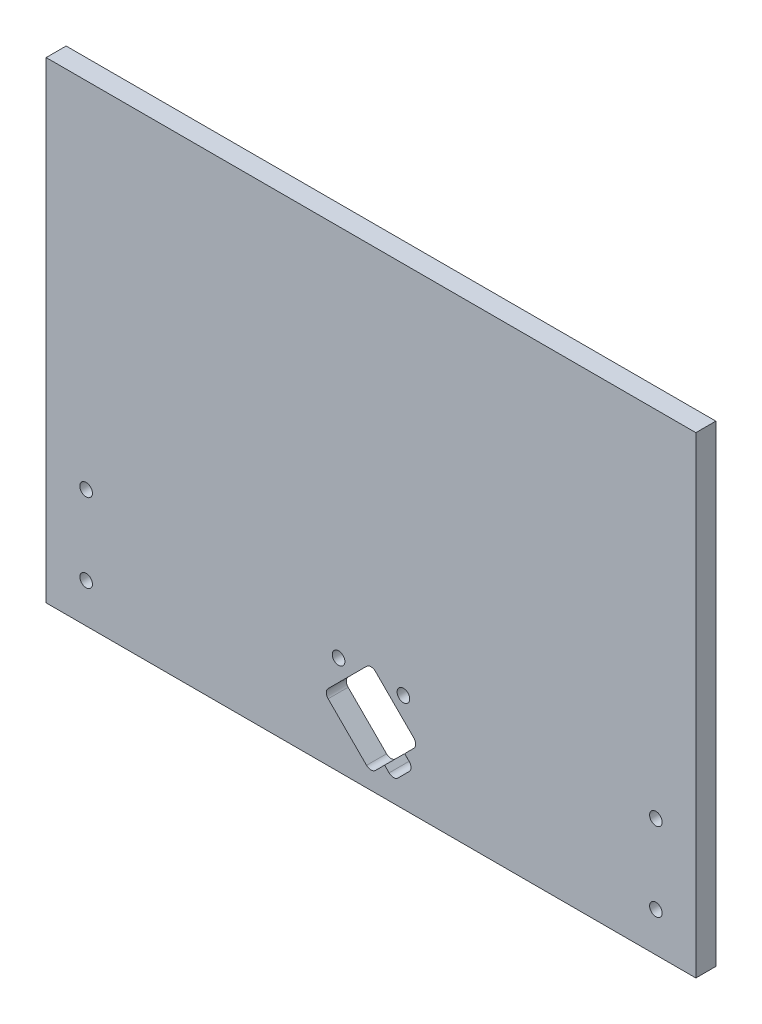
ISO-10303-21;
HEADER;
FILE_DESCRIPTION(('STEP AP214'),'2;1');
FILE_NAME('part.step','',(''),(''),'','','');
FILE_SCHEMA(('AUTOMOTIVE_DESIGN { 1 0 10303 214 1 1 1 1 }'));
ENDSEC;
DATA;
#1=APPLICATION_CONTEXT('core data for automotive mechanical design processes');
#2=APPLICATION_PROTOCOL_DEFINITION('international standard','automotive_design',2000,#1);
#3=PRODUCT_CONTEXT('',#1,'mechanical');
#4=PRODUCT('Part','Part','',(#3));
#5=PRODUCT_RELATED_PRODUCT_CATEGORY('part','',(#4));
#6=PRODUCT_DEFINITION_FORMATION('','',#4);
#7=PRODUCT_DEFINITION_CONTEXT('part definition',#1,'design');
#8=PRODUCT_DEFINITION('design','',#6,#7);
#9=PRODUCT_DEFINITION_SHAPE('','',#8);
#10=(LENGTH_UNIT() NAMED_UNIT(*) SI_UNIT(.MILLI.,.METRE.));
#11=(NAMED_UNIT(*) PLANE_ANGLE_UNIT() SI_UNIT($,.RADIAN.));
#12=(NAMED_UNIT(*) SI_UNIT($,.STERADIAN.) SOLID_ANGLE_UNIT());
#13=UNCERTAINTY_MEASURE_WITH_UNIT(LENGTH_MEASURE(1.E-05),#10,'distance_accuracy_value','');
#14=(GEOMETRIC_REPRESENTATION_CONTEXT(3) GLOBAL_UNCERTAINTY_ASSIGNED_CONTEXT((#13)) GLOBAL_UNIT_ASSIGNED_CONTEXT((#10,
#11,#12)) REPRESENTATION_CONTEXT('',''));
#15=CARTESIAN_POINT('',(0.,0.,0.));
#16=DIRECTION('',(0.,0.,1.));
#17=DIRECTION('',(1.,0.,0.));
#18=AXIS2_PLACEMENT_3D('',#15,#16,#17);
#19=CARTESIAN_POINT('',(-40.1571203693644,-40.1571203693645,12.7));
#20=DIRECTION('',(0.707106781186547,0.707106781186548,0.));
#21=DIRECTION('',(-0.707106781186548,0.707106781186547,0.));
#22=AXIS2_PLACEMENT_3D('',#19,#20,#21);
#23=PLANE('',#22);
#24=DIRECTION('',(0.707106781186548,-0.707106781186547,0.));
#25=VECTOR('',#24,1.);
#26=CARTESIAN_POINT('',(-40.1571203693644,-40.1571203693645,0.));
#27=LINE('',#26,#25);
#28=CARTESIAN_POINT('',(2.82842712474614,-83.142667863475,0.));
#29=VERTEX_POINT('',#28);
#30=CARTESIAN_POINT('',(27.2236110756821,-107.537851814411,0.));
#31=VERTEX_POINT('',#30);
#32=EDGE_CURVE('E233',#29,#31,#27,.T.);
#33=ORIENTED_EDGE('',*,*,#32,.T.);
#34=DIRECTION('',(0.,0.,-1.));
#35=VECTOR('',#34,1.);
#36=CARTESIAN_POINT('',(27.2236110756821,-107.537851814411,12.7));
#37=LINE('',#36,#35);
#38=CARTESIAN_POINT('',(27.2236110756821,-107.537851814411,12.7));
#39=VERTEX_POINT('',#38);
#40=EDGE_CURVE('E286',#31,#39,#37,.F.);
#41=ORIENTED_EDGE('',*,*,#40,.T.);
#42=DIRECTION('',(0.707106781186548,-0.707106781186547,0.));
#43=VECTOR('',#42,1.);
#44=CARTESIAN_POINT('',(-40.1571203693644,-40.1571203693645,12.7));
#45=LINE('',#44,#43);
#46=CARTESIAN_POINT('',(2.82842712474614,-83.142667863475,12.7));
#47=VERTEX_POINT('',#46);
#48=EDGE_CURVE('E196',#47,#39,#45,.T.);
#49=ORIENTED_EDGE('',*,*,#48,.F.);
#50=DIRECTION('',(0.,0.,-1.));
#51=VECTOR('',#50,1.);
#52=CARTESIAN_POINT('',(2.82842712474614,-83.142667863475,0.));
#53=LINE('',#52,#51);
#54=EDGE_CURVE('E283',#47,#29,#53,.T.);
#55=ORIENTED_EDGE('',*,*,#54,.T.);
#56=EDGE_LOOP('',(#33,#41,#49,#55));
#57=FACE_BOUND('',#56,.T.);
#58=ADVANCED_FACE('F34',(#57),#23,.F.);
#59=CARTESIAN_POINT('',(70.2091585697927,-70.2091585697927,12.7));
#60=DIRECTION('',(0.707106781186548,-0.707106781186547,0.));
#61=DIRECTION('',(0.707106781186547,0.707106781186548,0.));
#62=AXIS2_PLACEMENT_3D('',#59,#60,#61);
#63=PLANE('',#62);
#64=DIRECTION('',(-0.707106781186547,-0.707106781186548,0.));
#65=VECTOR('',#64,1.);
#66=CARTESIAN_POINT('',(70.2091585697927,-70.2091585697927,12.7));
#67=LINE('',#66,#65);
#68=CARTESIAN_POINT('',(27.2236110756821,-113.194706063903,12.7));
#69=VERTEX_POINT('',#68);
#70=CARTESIAN_POINT('',(21.3899801308931,-119.028337008692,12.7));
#71=VERTEX_POINT('',#70);
#72=EDGE_CURVE('E199',#69,#71,#67,.T.);
#73=ORIENTED_EDGE('',*,*,#72,.F.);
#74=DIRECTION('',(0.,0.,-1.));
#75=VECTOR('',#74,1.);
#76=CARTESIAN_POINT('',(27.2236110756821,-113.194706063903,0.));
#77=LINE('',#76,#75);
#78=CARTESIAN_POINT('',(27.2236110756821,-113.194706063903,0.));
#79=VERTEX_POINT('',#78);
#80=EDGE_CURVE('E280',#69,#79,#77,.T.);
#81=ORIENTED_EDGE('',*,*,#80,.T.);
#82=DIRECTION('',(-0.707106781186547,-0.707106781186548,0.));
#83=VECTOR('',#82,1.);
#84=CARTESIAN_POINT('',(70.2091585697927,-70.2091585697927,0.));
#85=LINE('',#84,#83);
#86=CARTESIAN_POINT('',(21.3899801308931,-119.028337008692,0.));
#87=VERTEX_POINT('',#86);
#88=EDGE_CURVE('E236',#79,#87,#85,.T.);
#89=ORIENTED_EDGE('',*,*,#88,.T.);
#90=DIRECTION('',(0.,0.,-1.));
#91=VECTOR('',#90,1.);
#92=CARTESIAN_POINT('',(21.3899801308931,-119.028337008692,12.7));
#93=LINE('',#92,#91);
#94=EDGE_CURVE('E255',#71,#87,#93,.T.);
#95=ORIENTED_EDGE('',*,*,#94,.F.);
#96=EDGE_LOOP('',(#73,#81,#89,#95));
#97=FACE_BOUND('',#96,.T.);
#98=ADVANCED_FACE('F338',(#97),#63,.F.);
#99=CARTESIAN_POINT('',(-48.8191784388997,-48.8191784389,12.7));
#100=DIRECTION('',(0.707106781186545,0.70710678118655,0.));
#101=DIRECTION('',(-0.70710678118655,0.707106781186545,0.));
#102=AXIS2_PLACEMENT_3D('',#99,#100,#101);
#103=PLANE('',#102);
#104=DIRECTION('',(0.70710678118655,-0.707106781186545,0.));
#105=VECTOR('',#104,1.);
#106=CARTESIAN_POINT('',(-48.8191784388997,-48.8191784389,0.));
#107=LINE('',#106,#105);
#108=CARTESIAN_POINT('',(24.2184072556392,-121.856764133439,0.));
#109=VERTEX_POINT('',#108);
#110=EDGE_CURVE('E238',#87,#109,#107,.T.);
#111=ORIENTED_EDGE('',*,*,#110,.T.);
#112=DIRECTION('',(0.,0.,-1.));
#113=VECTOR('',#112,1.);
#114=CARTESIAN_POINT('',(24.2184072556392,-121.856764133439,12.7));
#115=LINE('',#114,#113);
#116=CARTESIAN_POINT('',(24.2184072556392,-121.856764133439,12.7));
#117=VERTEX_POINT('',#116);
#118=EDGE_CURVE('E271',#109,#117,#115,.F.);
#119=ORIENTED_EDGE('',*,*,#118,.T.);
#120=DIRECTION('',(0.70710678118655,-0.707106781186545,0.));
#121=VECTOR('',#120,1.);
#122=CARTESIAN_POINT('',(-48.8191784388997,-48.8191784389,12.7));
#123=LINE('',#122,#121);
#124=EDGE_CURVE('E201',#71,#117,#123,.T.);
#125=ORIENTED_EDGE('',*,*,#124,.F.);
#126=ORIENTED_EDGE('',*,*,#94,.T.);
#127=EDGE_LOOP('',(#111,#119,#125,#126));
#128=FACE_BOUND('',#127,.T.);
#129=ADVANCED_FACE('F382',(#128),#103,.F.);
#130=CARTESIAN_POINT('',(75.8660128192851,-75.8660128192851,12.7));
#131=DIRECTION('',(0.707106781186547,-0.707106781186548,0.));
#132=DIRECTION('',(0.707106781186548,0.707106781186547,0.));
#133=AXIS2_PLACEMENT_3D('',#130,#131,#132);
#134=PLANE('',#133);
#135=DIRECTION('',(-0.707106781186548,-0.707106781186547,0.));
#136=VECTOR('',#135,1.);
#137=CARTESIAN_POINT('',(75.8660128192851,-75.8660128192851,0.));
#138=LINE('',#137,#136);
#139=CARTESIAN_POINT('',(24.2184072556393,-127.513618382931,0.));
#140=VERTEX_POINT('',#139);
#141=CARTESIAN_POINT('',(17.1473394437737,-134.584686194796,0.));
#142=VERTEX_POINT('',#141);
#143=EDGE_CURVE('E241',#140,#142,#138,.T.);
#144=ORIENTED_EDGE('',*,*,#143,.T.);
#145=DIRECTION('',(0.,0.,-1.));
#146=VECTOR('',#145,1.);
#147=CARTESIAN_POINT('',(17.1473394437737,-134.584686194796,12.7));
#148=LINE('',#147,#146);
#149=CARTESIAN_POINT('',(17.1473394437737,-134.584686194796,12.7));
#150=VERTEX_POINT('',#149);
#151=EDGE_CURVE('E269',#142,#150,#148,.F.);
#152=ORIENTED_EDGE('',*,*,#151,.T.);
#153=DIRECTION('',(-0.707106781186548,-0.707106781186547,0.));
#154=VECTOR('',#153,1.);
#155=CARTESIAN_POINT('',(75.8660128192851,-75.8660128192851,12.7));
#156=LINE('',#155,#154);
#157=CARTESIAN_POINT('',(24.2184072556393,-127.513618382931,12.7));
#158=VERTEX_POINT('',#157);
#159=EDGE_CURVE('E204',#158,#150,#156,.T.);
#160=ORIENTED_EDGE('',*,*,#159,.F.);
#161=DIRECTION('',(0.,0.,-1.));
#162=VECTOR('',#161,1.);
#163=CARTESIAN_POINT('',(24.2184072556393,-127.513618382931,0.));
#164=LINE('',#163,#162);
#165=EDGE_CURVE('E266',#158,#140,#164,.T.);
#166=ORIENTED_EDGE('',*,*,#165,.T.);
#167=EDGE_LOOP('',(#144,#152,#160,#166));
#168=FACE_BOUND('',#167,.T.);
#169=ADVANCED_FACE('F350',(#168),#134,.F.);
#170=CARTESIAN_POINT('',(-61.5471005002575,-61.5471005002568,12.7));
#171=DIRECTION('',(0.707106781186551,0.707106781186544,0.));
#172=DIRECTION('',(-0.707106781186544,0.707106781186551,0.));
#173=AXIS2_PLACEMENT_3D('',#170,#171,#172);
#174=PLANE('',#173);
#175=DIRECTION('',(0.707106781186544,-0.707106781186551,0.));
#176=VECTOR('',#175,1.);
#177=CARTESIAN_POINT('',(-61.5471005002575,-61.5471005002568,12.7));
#178=LINE('',#177,#176);
#179=CARTESIAN_POINT('',(8.66205806953518,-131.75625907005,12.7));
#180=VERTEX_POINT('',#179);
#181=CARTESIAN_POINT('',(11.4904851942814,-134.584686194796,12.7));
#182=VERTEX_POINT('',#181);
#183=EDGE_CURVE('E207',#180,#182,#178,.T.);
#184=ORIENTED_EDGE('',*,*,#183,.T.);
#185=DIRECTION('',(0.,0.,-1.));
#186=VECTOR('',#185,1.);
#187=CARTESIAN_POINT('',(11.4904851942813,-134.584686194796,12.7));
#188=LINE('',#187,#186);
#189=CARTESIAN_POINT('',(11.4904851942814,-134.584686194796,0.));
#190=VERTEX_POINT('',#189);
#191=EDGE_CURVE('E258',#182,#190,#188,.T.);
#192=ORIENTED_EDGE('',*,*,#191,.T.);
#193=DIRECTION('',(0.707106781186544,-0.707106781186551,0.));
#194=VECTOR('',#193,1.);
#195=CARTESIAN_POINT('',(-61.5471005002575,-61.5471005002568,0.));
#196=LINE('',#195,#194);
#197=CARTESIAN_POINT('',(8.66205806953518,-131.75625907005,0.));
#198=VERTEX_POINT('',#197);
#199=EDGE_CURVE('E244',#198,#190,#196,.T.);
#200=ORIENTED_EDGE('',*,*,#199,.F.);
#201=DIRECTION('',(0.,0.,-1.));
#202=VECTOR('',#201,1.);
#203=CARTESIAN_POINT('',(8.66205806953518,-131.75625907005,12.7));
#204=LINE('',#203,#202);
#205=EDGE_CURVE('E169',#180,#198,#204,.T.);
#206=ORIENTED_EDGE('',*,*,#205,.F.);
#207=EDGE_LOOP('',(#184,#192,#200,#206));
#208=FACE_BOUND('',#207,.T.);
#209=ADVANCED_FACE('F358',(#208),#174,.T.);
#210=CARTESIAN_POINT('',(70.2091585697927,-70.2091585697926,12.7));
#211=DIRECTION('',(-0.707106781186548,0.707106781186547,0.));
#212=DIRECTION('',(-0.707106781186547,-0.707106781186548,0.));
#213=AXIS2_PLACEMENT_3D('',#210,#211,#212);
#214=PLANE('',#213);
#215=DIRECTION('',(0.707106781186547,0.707106781186548,0.));
#216=VECTOR('',#215,1.);
#217=CARTESIAN_POINT('',(70.2091585697927,-70.2091585697926,0.));
#218=LINE('',#217,#216);
#219=CARTESIAN_POINT('',(2.82842712474618,-137.589890014839,0.));
#220=VERTEX_POINT('',#219);
#221=EDGE_CURVE('E247',#220,#198,#218,.T.);
#222=ORIENTED_EDGE('',*,*,#221,.F.);
#223=DIRECTION('',(0.,0.,-1.));
#224=VECTOR('',#223,1.);
#225=CARTESIAN_POINT('',(2.82842712474618,-137.589890014839,12.7));
#226=LINE('',#225,#224);
#227=CARTESIAN_POINT('',(2.82842712474618,-137.589890014839,12.7));
#228=VERTEX_POINT('',#227);
#229=EDGE_CURVE('E278',#220,#228,#226,.F.);
#230=ORIENTED_EDGE('',*,*,#229,.T.);
#231=DIRECTION('',(0.707106781186547,0.707106781186548,0.));
#232=VECTOR('',#231,1.);
#233=CARTESIAN_POINT('',(70.2091585697927,-70.2091585697926,12.7));
#234=LINE('',#233,#232);
#235=EDGE_CURVE('E210',#228,#180,#234,.T.);
#236=ORIENTED_EDGE('',*,*,#235,.T.);
#237=ORIENTED_EDGE('',*,*,#205,.T.);
#238=EDGE_LOOP('',(#222,#230,#236,#237));
#239=FACE_BOUND('',#238,.T.);
#240=ADVANCED_FACE('F368',(#239),#214,.T.);
#241=CARTESIAN_POINT('',(-70.2091585697927,-70.2091585697927,12.7));
#242=DIRECTION('',(0.707106781186548,0.707106781186548,0.));
#243=DIRECTION('',(-0.707106781186548,0.707106781186548,0.));
#244=AXIS2_PLACEMENT_3D('',#241,#242,#243);
#245=PLANE('',#244);
#246=DIRECTION('',(0.707106781186548,-0.707106781186548,0.));
#247=VECTOR('',#246,1.);
#248=CARTESIAN_POINT('',(-70.2091585697927,-70.2091585697927,12.7));
#249=LINE('',#248,#247);
#250=CARTESIAN_POINT('',(-27.2236110756821,-113.194706063903,12.7));
#251=VERTEX_POINT('',#250);
#252=CARTESIAN_POINT('',(-2.82842712474619,-137.589890014839,12.7));
#253=VERTEX_POINT('',#252);
#254=EDGE_CURVE('E212',#251,#253,#249,.T.);
#255=ORIENTED_EDGE('',*,*,#254,.T.);
#256=DIRECTION('',(0.,0.,-1.));
#257=VECTOR('',#256,1.);
#258=CARTESIAN_POINT('',(-2.82842712474621,-137.589890014839,0.));
#259=LINE('',#258,#257);
#260=CARTESIAN_POINT('',(-2.82842712474619,-137.589890014839,0.));
#261=VERTEX_POINT('',#260);
#262=EDGE_CURVE('E275',#253,#261,#259,.T.);
#263=ORIENTED_EDGE('',*,*,#262,.T.);
#264=DIRECTION('',(0.707106781186548,-0.707106781186548,0.));
#265=VECTOR('',#264,1.);
#266=CARTESIAN_POINT('',(-70.2091585697927,-70.2091585697927,0.));
#267=LINE('',#266,#265);
#268=CARTESIAN_POINT('',(-27.2236110756821,-113.194706063903,0.));
#269=VERTEX_POINT('',#268);
#270=EDGE_CURVE('E249',#269,#261,#267,.T.);
#271=ORIENTED_EDGE('',*,*,#270,.F.);
#272=DIRECTION('',(0.,0.,-1.));
#273=VECTOR('',#272,1.);
#274=CARTESIAN_POINT('',(-27.2236110756821,-113.194706063903,12.7));
#275=LINE('',#274,#273);
#276=EDGE_CURVE('E273',#269,#251,#275,.F.);
#277=ORIENTED_EDGE('',*,*,#276,.T.);
#278=EDGE_LOOP('',(#255,#263,#271,#277));
#279=FACE_BOUND('',#278,.T.);
#280=ADVANCED_FACE('F320',(#279),#245,.T.);
#281=CARTESIAN_POINT('',(-206.35,0.,12.7));
#282=DIRECTION('',(-1.,0.,0.));
#283=DIRECTION('',(0.,0.,1.));
#284=AXIS2_PLACEMENT_3D('',#281,#282,#283);
#285=PLANE('',#284);
#286=DIRECTION('',(0.,1.,0.));
#287=VECTOR('',#286,1.);
#288=CARTESIAN_POINT('',(-206.35,0.,0.));
#289=LINE('',#288,#287);
#290=CARTESIAN_POINT('',(-206.35,-150.,0.));
#291=VERTEX_POINT('',#290);
#292=CARTESIAN_POINT('',(-206.35,150.,0.));
#293=VERTEX_POINT('',#292);
#294=EDGE_CURVE('E164',#291,#293,#289,.T.);
#295=ORIENTED_EDGE('',*,*,#294,.F.);
#296=DIRECTION('',(0.,0.,-1.));
#297=VECTOR('',#296,1.);
#298=CARTESIAN_POINT('',(-206.35,-150.,12.7));
#299=LINE('',#298,#297);
#300=CARTESIAN_POINT('',(-206.35,-150.,12.7));
#301=VERTEX_POINT('',#300);
#302=EDGE_CURVE('E159',#301,#291,#299,.T.);
#303=ORIENTED_EDGE('',*,*,#302,.F.);
#304=DIRECTION('',(0.,1.,0.));
#305=VECTOR('',#304,1.);
#306=CARTESIAN_POINT('',(-206.35,0.,12.7));
#307=LINE('',#306,#305);
#308=CARTESIAN_POINT('',(-206.35,150.,12.7));
#309=VERTEX_POINT('',#308);
#310=EDGE_CURVE('E162',#301,#309,#307,.T.);
#311=ORIENTED_EDGE('',*,*,#310,.T.);
#312=DIRECTION('',(0.,0.,-1.));
#313=VECTOR('',#312,1.);
#314=CARTESIAN_POINT('',(-206.35,150.,12.7));
#315=LINE('',#314,#313);
#316=EDGE_CURVE('E217',#309,#293,#315,.T.);
#317=ORIENTED_EDGE('',*,*,#316,.T.);
#318=EDGE_LOOP('',(#295,#303,#311,#317));
#319=FACE_BOUND('',#318,.T.);
#320=ADVANCED_FACE('F161',(#319),#285,.T.);
#321=CARTESIAN_POINT('',(0.,-150.,12.7));
#322=DIRECTION('',(0.,-1.,0.));
#323=DIRECTION('',(0.,0.,-1.));
#324=AXIS2_PLACEMENT_3D('',#321,#322,#323);
#325=PLANE('',#324);
#326=DIRECTION('',(-1.,0.,0.));
#327=VECTOR('',#326,1.);
#328=CARTESIAN_POINT('',(0.,-150.,0.));
#329=LINE('',#328,#327);
#330=CARTESIAN_POINT('',(206.35,-150.,0.));
#331=VERTEX_POINT('',#330);
#332=EDGE_CURVE('E219',#331,#291,#329,.T.);
#333=ORIENTED_EDGE('',*,*,#332,.F.);
#334=DIRECTION('',(0.,0.,-1.));
#335=VECTOR('',#334,1.);
#336=CARTESIAN_POINT('',(206.35,-150.,12.7));
#337=LINE('',#336,#335);
#338=CARTESIAN_POINT('',(206.35,-150.,12.7));
#339=VERTEX_POINT('',#338);
#340=EDGE_CURVE('E170',#339,#331,#337,.T.);
#341=ORIENTED_EDGE('',*,*,#340,.F.);
#342=DIRECTION('',(-1.,0.,0.));
#343=VECTOR('',#342,1.);
#344=CARTESIAN_POINT('',(0.,-150.,12.7));
#345=LINE('',#344,#343);
#346=EDGE_CURVE('E176',#339,#301,#345,.T.);
#347=ORIENTED_EDGE('',*,*,#346,.T.);
#348=ORIENTED_EDGE('',*,*,#302,.T.);
#349=EDGE_LOOP('',(#333,#341,#347,#348));
#350=FACE_BOUND('',#349,.T.);
#351=ADVANCED_FACE('F182',(#350),#325,.T.);
#352=CARTESIAN_POINT('',(206.35,0.,12.7));
#353=DIRECTION('',(-1.,0.,0.));
#354=DIRECTION('',(0.,-1.,0.));
#355=AXIS2_PLACEMENT_3D('',#352,#353,#354);
#356=PLANE('',#355);
#357=DIRECTION('',(0.,1.,0.));
#358=VECTOR('',#357,1.);
#359=CARTESIAN_POINT('',(206.35,0.,0.));
#360=LINE('',#359,#358);
#361=CARTESIAN_POINT('',(206.35,150.,0.));
#362=VERTEX_POINT('',#361);
#363=EDGE_CURVE('E222',#331,#362,#360,.T.);
#364=ORIENTED_EDGE('',*,*,#363,.T.);
#365=DIRECTION('',(0.,0.,-1.));
#366=VECTOR('',#365,1.);
#367=CARTESIAN_POINT('',(206.35,150.,12.7));
#368=LINE('',#367,#366);
#369=CARTESIAN_POINT('',(206.35,150.,12.7));
#370=VERTEX_POINT('',#369);
#371=EDGE_CURVE('E260',#370,#362,#368,.T.);
#372=ORIENTED_EDGE('',*,*,#371,.F.);
#373=DIRECTION('',(0.,1.,0.));
#374=VECTOR('',#373,1.);
#375=CARTESIAN_POINT('',(206.35,0.,12.7));
#376=LINE('',#375,#374);
#377=EDGE_CURVE('E184',#339,#370,#376,.T.);
#378=ORIENTED_EDGE('',*,*,#377,.F.);
#379=ORIENTED_EDGE('',*,*,#340,.T.);
#380=EDGE_LOOP('',(#364,#372,#378,#379));
#381=FACE_BOUND('',#380,.T.);
#382=ADVANCED_FACE('F390',(#381),#356,.F.);
#383=CARTESIAN_POINT('',(20.5900655847,-87.4663855753,12.7));
#384=DIRECTION('',(0.,0.,-1.));
#385=DIRECTION('',(-1.,0.,0.));
#386=AXIS2_PLACEMENT_3D('',#383,#384,#385);
#387=CYLINDRICAL_SURFACE('',#386,4.);
#388=CARTESIAN_POINT('',(20.5900655847,-87.4663855753,12.7));
#389=DIRECTION('',(0.,0.,1.));
#390=DIRECTION('',(1.,0.,0.));
#391=AXIS2_PLACEMENT_3D('',#388,#389,#390);
#392=CIRCLE('',#391,4.);
#393=CARTESIAN_POINT('',(24.5900655847,-87.4663855753,12.7));
#394=VERTEX_POINT('',#393);
#395=EDGE_CURVE('E193',#394,#394,#392,.T.);
#396=ORIENTED_EDGE('',*,*,#395,.T.);
#397=EDGE_LOOP('',(#396));
#398=FACE_BOUND('',#397,.T.);
#399=CARTESIAN_POINT('',(20.5900655847,-87.4663855753,0.));
#400=DIRECTION('',(0.,0.,1.));
#401=DIRECTION('',(1.,0.,0.));
#402=AXIS2_PLACEMENT_3D('',#399,#400,#401);
#403=CIRCLE('',#402,4.);
#404=CARTESIAN_POINT('',(24.5900655847,-87.4663855753,0.));
#405=VERTEX_POINT('',#404);
#406=EDGE_CURVE('E230',#405,#405,#403,.T.);
#407=ORIENTED_EDGE('',*,*,#406,.F.);
#408=EDGE_LOOP('',(#407));
#409=FACE_BOUND('',#408,.T.);
#410=ADVANCED_FACE('F386',(#398,#409),#387,.F.);
#411=CARTESIAN_POINT('',(-20.5900655847,-87.4663855753,12.7));
#412=DIRECTION('',(0.,0.,-1.));
#413=DIRECTION('',(-1.,0.,0.));
#414=AXIS2_PLACEMENT_3D('',#411,#412,#413);
#415=CYLINDRICAL_SURFACE('',#414,3.99999999999999);
#416=CARTESIAN_POINT('',(-20.5900655847,-87.4663855753,12.7));
#417=DIRECTION('',(0.,0.,1.));
#418=DIRECTION('',(1.,0.,0.));
#419=AXIS2_PLACEMENT_3D('',#416,#417,#418);
#420=CIRCLE('',#419,3.99999999999999);
#421=CARTESIAN_POINT('',(-16.5900655847,-87.4663855753,12.7));
#422=VERTEX_POINT('',#421);
#423=EDGE_CURVE('E190',#422,#422,#420,.T.);
#424=ORIENTED_EDGE('',*,*,#423,.T.);
#425=EDGE_LOOP('',(#424));
#426=FACE_BOUND('',#425,.T.);
#427=CARTESIAN_POINT('',(-20.5900655847,-87.4663855753,0.));
#428=DIRECTION('',(0.,0.,1.));
#429=DIRECTION('',(1.,0.,0.));
#430=AXIS2_PLACEMENT_3D('',#427,#428,#429);
#431=CIRCLE('',#430,3.99999999999999);
#432=CARTESIAN_POINT('',(-16.5900655847,-87.4663855753,0.));
#433=VERTEX_POINT('',#432);
#434=EDGE_CURVE('E227',#433,#433,#431,.T.);
#435=ORIENTED_EDGE('',*,*,#434,.F.);
#436=EDGE_LOOP('',(#435));
#437=FACE_BOUND('',#436,.T.);
#438=ADVANCED_FACE('F389',(#426,#437),#415,.F.);
#439=CARTESIAN_POINT('',(0.,150.,12.7));
#440=DIRECTION('',(0.,-1.,0.));
#441=DIRECTION('',(0.,0.,-1.));
#442=AXIS2_PLACEMENT_3D('',#439,#440,#441);
#443=PLANE('',#442);
#444=DIRECTION('',(-1.,0.,0.));
#445=VECTOR('',#444,1.);
#446=CARTESIAN_POINT('',(0.,150.,0.));
#447=LINE('',#446,#445);
#448=EDGE_CURVE('E224',#362,#293,#447,.T.);
#449=ORIENTED_EDGE('',*,*,#448,.T.);
#450=ORIENTED_EDGE('',*,*,#316,.F.);
#451=DIRECTION('',(-1.,0.,0.));
#452=VECTOR('',#451,1.);
#453=CARTESIAN_POINT('',(0.,150.,12.7));
#454=LINE('',#453,#452);
#455=EDGE_CURVE('E178',#370,#309,#454,.T.);
#456=ORIENTED_EDGE('',*,*,#455,.F.);
#457=ORIENTED_EDGE('',*,*,#371,.T.);
#458=EDGE_LOOP('',(#449,#450,#456,#457));
#459=FACE_BOUND('',#458,.T.);
#460=ADVANCED_FACE('F394',(#459),#443,.F.);
#461=CARTESIAN_POINT('',(40.1571203693644,-40.1571203693643,12.7));
#462=DIRECTION('',(-0.707106781186548,0.707106781186547,0.));
#463=DIRECTION('',(-0.707106781186547,-0.707106781186548,0.));
#464=AXIS2_PLACEMENT_3D('',#461,#462,#463);
#465=PLANE('',#464);
#466=DIRECTION('',(0.707106781186547,0.707106781186548,0.));
#467=VECTOR('',#466,1.);
#468=CARTESIAN_POINT('',(40.1571203693644,-40.1571203693643,0.));
#469=LINE('',#468,#467);
#470=CARTESIAN_POINT('',(-27.2236110756821,-107.537851814411,0.));
#471=VERTEX_POINT('',#470);
#472=CARTESIAN_POINT('',(-2.82842712474624,-83.142667863475,0.));
#473=VERTEX_POINT('',#472);
#474=EDGE_CURVE('E180',#471,#473,#469,.T.);
#475=ORIENTED_EDGE('',*,*,#474,.T.);
#476=DIRECTION('',(0.,0.,-1.));
#477=VECTOR('',#476,1.);
#478=CARTESIAN_POINT('',(-2.82842712474625,-83.142667863475,12.7));
#479=LINE('',#478,#477);
#480=CARTESIAN_POINT('',(-2.82842712474624,-83.142667863475,12.7));
#481=VERTEX_POINT('',#480);
#482=EDGE_CURVE('E49',#473,#481,#479,.F.);
#483=ORIENTED_EDGE('',*,*,#482,.T.);
#484=DIRECTION('',(0.707106781186547,0.707106781186548,0.));
#485=VECTOR('',#484,1.);
#486=CARTESIAN_POINT('',(40.1571203693644,-40.1571203693643,12.7));
#487=LINE('',#486,#485);
#488=CARTESIAN_POINT('',(-27.2236110756821,-107.537851814411,12.7));
#489=VERTEX_POINT('',#488);
#490=EDGE_CURVE('E215',#489,#481,#487,.T.);
#491=ORIENTED_EDGE('',*,*,#490,.F.);
#492=DIRECTION('',(0.,0.,-1.));
#493=VECTOR('',#492,1.);
#494=CARTESIAN_POINT('',(-27.2236110756821,-107.537851814411,12.7));
#495=LINE('',#494,#493);
#496=EDGE_CURVE('E288',#489,#471,#495,.T.);
#497=ORIENTED_EDGE('',*,*,#496,.T.);
#498=EDGE_LOOP('',(#475,#483,#491,#497));
#499=FACE_BOUND('',#498,.T.);
#500=ADVANCED_FACE('F322',(#499),#465,.F.);
#501=CARTESIAN_POINT('',(0.,0.,12.7));
#502=DIRECTION('',(0.,0.,1.));
#503=DIRECTION('',(1.,0.,0.));
#504=AXIS2_PLACEMENT_3D('',#501,#502,#503);
#505=PLANE('',#504);
#506=CARTESIAN_POINT('',(180.95,-75.,12.7));
#507=DIRECTION('',(0.,0.,1.));
#508=DIRECTION('',(-1.,0.,0.));
#509=AXIS2_PLACEMENT_3D('',#506,#507,#508);
#510=CIRCLE('',#509,3.99999999999999);
#511=CARTESIAN_POINT('',(176.95,-75.,12.7));
#512=VERTEX_POINT('',#511);
#513=EDGE_CURVE('E627',#512,#512,#510,.T.);
#514=ORIENTED_EDGE('',*,*,#513,.F.);
#515=EDGE_LOOP('',(#514));
#516=FACE_BOUND('',#515,.T.);
#517=CARTESIAN_POINT('',(180.95,-125.,12.7));
#518=DIRECTION('',(0.,0.,1.));
#519=DIRECTION('',(1.,0.,0.));
#520=AXIS2_PLACEMENT_3D('',#517,#518,#519);
#521=CIRCLE('',#520,3.99999999999999);
#522=CARTESIAN_POINT('',(184.95,-125.,12.7));
#523=VERTEX_POINT('',#522);
#524=EDGE_CURVE('E621',#523,#523,#521,.T.);
#525=ORIENTED_EDGE('',*,*,#524,.F.);
#526=EDGE_LOOP('',(#525));
#527=FACE_BOUND('',#526,.T.);
#528=CARTESIAN_POINT('',(-180.95,-125.,12.7));
#529=DIRECTION('',(0.,0.,1.));
#530=DIRECTION('',(-1.,0.,0.));
#531=AXIS2_PLACEMENT_3D('',#528,#529,#530);
#532=CIRCLE('',#531,3.99999999999999);
#533=CARTESIAN_POINT('',(-184.95,-125.,12.7));
#534=VERTEX_POINT('',#533);
#535=EDGE_CURVE('E615',#534,#534,#532,.T.);
#536=ORIENTED_EDGE('',*,*,#535,.F.);
#537=EDGE_LOOP('',(#536));
#538=FACE_BOUND('',#537,.T.);
#539=CARTESIAN_POINT('',(-180.95,-74.9999999999999,12.7));
#540=DIRECTION('',(0.,0.,1.));
#541=DIRECTION('',(1.,0.,0.));
#542=AXIS2_PLACEMENT_3D('',#539,#540,#541);
#543=CIRCLE('',#542,3.99999999999999);
#544=CARTESIAN_POINT('',(-176.95,-74.9999999999999,12.7));
#545=VERTEX_POINT('',#544);
#546=EDGE_CURVE('E606',#545,#545,#543,.T.);
#547=ORIENTED_EDGE('',*,*,#546,.F.);
#548=EDGE_LOOP('',(#547));
#549=FACE_BOUND('',#548,.T.);
#550=ORIENTED_EDGE('',*,*,#310,.F.);
#551=ORIENTED_EDGE('',*,*,#346,.F.);
#552=ORIENTED_EDGE('',*,*,#377,.T.);
#553=ORIENTED_EDGE('',*,*,#455,.T.);
#554=EDGE_LOOP('',(#550,#551,#552,#553));
#555=FACE_BOUND('',#554,.T.);
#556=ORIENTED_EDGE('',*,*,#423,.F.);
#557=EDGE_LOOP('',(#556));
#558=FACE_BOUND('',#557,.T.);
#559=ORIENTED_EDGE('',*,*,#395,.F.);
#560=EDGE_LOOP('',(#559));
#561=FACE_BOUND('',#560,.T.);
#562=ORIENTED_EDGE('',*,*,#490,.T.);
#563=CARTESIAN_POINT('',(0.,-85.9710949882212,12.7));
#564=DIRECTION('',(0.,0.,1.));
#565=DIRECTION('',(1.,0.,0.));
#566=AXIS2_PLACEMENT_3D('',#563,#564,#565);
#567=CIRCLE('',#566,4.);
#568=EDGE_CURVE('E310',#481,#47,#567,.F.);
#569=ORIENTED_EDGE('',*,*,#568,.T.);
#570=ORIENTED_EDGE('',*,*,#48,.T.);
#571=CARTESIAN_POINT('',(24.3951839509359,-110.366278939157,12.7));
#572=DIRECTION('',(0.,0.,1.));
#573=DIRECTION('',(1.,0.,0.));
#574=AXIS2_PLACEMENT_3D('',#571,#572,#573);
#575=CIRCLE('',#574,4.);
#576=EDGE_CURVE('E306',#39,#69,#575,.F.);
#577=ORIENTED_EDGE('',*,*,#576,.T.);
#578=ORIENTED_EDGE('',*,*,#72,.T.);
#579=ORIENTED_EDGE('',*,*,#124,.T.);
#580=CARTESIAN_POINT('',(21.3899801308931,-124.685191258185,12.7));
#581=DIRECTION('',(0.,0.,1.));
#582=DIRECTION('',(1.,0.,0.));
#583=AXIS2_PLACEMENT_3D('',#580,#581,#582);
#584=CIRCLE('',#583,4.);
#585=EDGE_CURVE('E298',#117,#158,#584,.F.);
#586=ORIENTED_EDGE('',*,*,#585,.T.);
#587=ORIENTED_EDGE('',*,*,#159,.T.);
#588=CARTESIAN_POINT('',(14.3189123190276,-131.75625907005,12.7));
#589=DIRECTION('',(0.,0.,1.));
#590=DIRECTION('',(1.,0.,0.));
#591=AXIS2_PLACEMENT_3D('',#588,#589,#590);
#592=CIRCLE('',#591,4.);
#593=EDGE_CURVE('E294',#150,#182,#592,.F.);
#594=ORIENTED_EDGE('',*,*,#593,.T.);
#595=ORIENTED_EDGE('',*,*,#183,.F.);
#596=ORIENTED_EDGE('',*,*,#235,.F.);
#597=CARTESIAN_POINT('',(0.,-134.761462890093,12.7));
#598=DIRECTION('',(0.,0.,1.));
#599=DIRECTION('',(1.,0.,0.));
#600=AXIS2_PLACEMENT_3D('',#597,#598,#599);
#601=CIRCLE('',#600,4.);
#602=EDGE_CURVE('E302',#228,#253,#601,.F.);
#603=ORIENTED_EDGE('',*,*,#602,.T.);
#604=ORIENTED_EDGE('',*,*,#254,.F.);
#605=CARTESIAN_POINT('',(-24.3951839509359,-110.366278939157,12.7));
#606=DIRECTION('',(0.,0.,1.));
#607=DIRECTION('',(1.,0.,0.));
#608=AXIS2_PLACEMENT_3D('',#605,#606,#607);
#609=CIRCLE('',#608,4.);
#610=EDGE_CURVE('E11',#251,#489,#609,.F.);
#611=ORIENTED_EDGE('',*,*,#610,.T.);
#612=EDGE_LOOP('',(#562,#569,#570,#577,#578,#579,#586,#587,#594,#595,#596,#603,#604,#611));
#613=FACE_BOUND('',#612,.T.);
#614=ADVANCED_FACE('F174',(#516,#527,#538,#549,#555,#558,#561,#613),#505,.T.);
#615=CARTESIAN_POINT('',(0.,0.,0.));
#616=DIRECTION('',(0.,0.,1.));
#617=DIRECTION('',(1.,0.,0.));
#618=AXIS2_PLACEMENT_3D('',#615,#616,#617);
#619=PLANE('',#618);
#620=CARTESIAN_POINT('',(180.95,-75.,0.));
#621=DIRECTION('',(0.,0.,1.));
#622=DIRECTION('',(1.,0.,0.));
#623=AXIS2_PLACEMENT_3D('',#620,#621,#622);
#624=CIRCLE('',#623,3.99999999999999);
#625=CARTESIAN_POINT('',(184.95,-75.,0.));
#626=VERTEX_POINT('',#625);
#627=EDGE_CURVE('E624',#626,#626,#624,.F.);
#628=ORIENTED_EDGE('',*,*,#627,.F.);
#629=EDGE_LOOP('',(#628));
#630=FACE_BOUND('',#629,.T.);
#631=CARTESIAN_POINT('',(180.95,-125.,0.));
#632=DIRECTION('',(0.,0.,1.));
#633=DIRECTION('',(1.,0.,0.));
#634=AXIS2_PLACEMENT_3D('',#631,#632,#633);
#635=CIRCLE('',#634,3.99999999999999);
#636=CARTESIAN_POINT('',(184.95,-125.,0.));
#637=VERTEX_POINT('',#636);
#638=EDGE_CURVE('E618',#637,#637,#635,.F.);
#639=ORIENTED_EDGE('',*,*,#638,.F.);
#640=EDGE_LOOP('',(#639));
#641=FACE_BOUND('',#640,.T.);
#642=CARTESIAN_POINT('',(-180.95,-125.,0.));
#643=DIRECTION('',(0.,0.,1.));
#644=DIRECTION('',(1.,0.,0.));
#645=AXIS2_PLACEMENT_3D('',#642,#643,#644);
#646=CIRCLE('',#645,3.99999999999999);
#647=CARTESIAN_POINT('',(-176.95,-125.,0.));
#648=VERTEX_POINT('',#647);
#649=EDGE_CURVE('E610',#648,#648,#646,.F.);
#650=ORIENTED_EDGE('',*,*,#649,.F.);
#651=EDGE_LOOP('',(#650));
#652=FACE_BOUND('',#651,.T.);
#653=CARTESIAN_POINT('',(-180.95,-74.9999999999999,0.));
#654=DIRECTION('',(0.,0.,1.));
#655=DIRECTION('',(1.,0.,0.));
#656=AXIS2_PLACEMENT_3D('',#653,#654,#655);
#657=CIRCLE('',#656,3.99999999999999);
#658=CARTESIAN_POINT('',(-176.95,-74.9999999999999,0.));
#659=VERTEX_POINT('',#658);
#660=EDGE_CURVE('E220',#659,#659,#657,.F.);
#661=ORIENTED_EDGE('',*,*,#660,.F.);
#662=EDGE_LOOP('',(#661));
#663=FACE_BOUND('',#662,.T.);
#664=ORIENTED_EDGE('',*,*,#294,.T.);
#665=ORIENTED_EDGE('',*,*,#448,.F.);
#666=ORIENTED_EDGE('',*,*,#363,.F.);
#667=ORIENTED_EDGE('',*,*,#332,.T.);
#668=EDGE_LOOP('',(#664,#665,#666,#667));
#669=FACE_BOUND('',#668,.T.);
#670=ORIENTED_EDGE('',*,*,#434,.T.);
#671=EDGE_LOOP('',(#670));
#672=FACE_BOUND('',#671,.T.);
#673=ORIENTED_EDGE('',*,*,#406,.T.);
#674=EDGE_LOOP('',(#673));
#675=FACE_BOUND('',#674,.T.);
#676=ORIENTED_EDGE('',*,*,#32,.F.);
#677=CARTESIAN_POINT('',(0.,-85.9710949882212,0.));
#678=DIRECTION('',(0.,0.,1.));
#679=DIRECTION('',(1.,0.,0.));
#680=AXIS2_PLACEMENT_3D('',#677,#678,#679);
#681=CIRCLE('',#680,4.);
#682=EDGE_CURVE('E308',#29,#473,#681,.T.);
#683=ORIENTED_EDGE('',*,*,#682,.T.);
#684=ORIENTED_EDGE('',*,*,#474,.F.);
#685=CARTESIAN_POINT('',(-24.3951839509359,-110.366278939157,0.));
#686=DIRECTION('',(0.,0.,1.));
#687=DIRECTION('',(1.,0.,0.));
#688=AXIS2_PLACEMENT_3D('',#685,#686,#687);
#689=CIRCLE('',#688,4.);
#690=EDGE_CURVE('E42',#471,#269,#689,.T.);
#691=ORIENTED_EDGE('',*,*,#690,.T.);
#692=ORIENTED_EDGE('',*,*,#270,.T.);
#693=CARTESIAN_POINT('',(0.,-134.761462890093,0.));
#694=DIRECTION('',(0.,0.,1.));
#695=DIRECTION('',(1.,0.,0.));
#696=AXIS2_PLACEMENT_3D('',#693,#694,#695);
#697=CIRCLE('',#696,4.);
#698=EDGE_CURVE('E300',#261,#220,#697,.T.);
#699=ORIENTED_EDGE('',*,*,#698,.T.);
#700=ORIENTED_EDGE('',*,*,#221,.T.);
#701=ORIENTED_EDGE('',*,*,#199,.T.);
#702=CARTESIAN_POINT('',(14.3189123190276,-131.75625907005,0.));
#703=DIRECTION('',(0.,0.,1.));
#704=DIRECTION('',(1.,0.,0.));
#705=AXIS2_PLACEMENT_3D('',#702,#703,#704);
#706=CIRCLE('',#705,4.);
#707=EDGE_CURVE('E292',#190,#142,#706,.T.);
#708=ORIENTED_EDGE('',*,*,#707,.T.);
#709=ORIENTED_EDGE('',*,*,#143,.F.);
#710=CARTESIAN_POINT('',(21.3899801308931,-124.685191258185,0.));
#711=DIRECTION('',(0.,0.,1.));
#712=DIRECTION('',(1.,0.,0.));
#713=AXIS2_PLACEMENT_3D('',#710,#711,#712);
#714=CIRCLE('',#713,4.);
#715=EDGE_CURVE('E296',#140,#109,#714,.T.);
#716=ORIENTED_EDGE('',*,*,#715,.T.);
#717=ORIENTED_EDGE('',*,*,#110,.F.);
#718=ORIENTED_EDGE('',*,*,#88,.F.);
#719=CARTESIAN_POINT('',(24.3951839509359,-110.366278939157,0.));
#720=DIRECTION('',(0.,0.,1.));
#721=DIRECTION('',(1.,0.,0.));
#722=AXIS2_PLACEMENT_3D('',#719,#720,#721);
#723=CIRCLE('',#722,4.);
#724=EDGE_CURVE('E304',#79,#31,#723,.T.);
#725=ORIENTED_EDGE('',*,*,#724,.T.);
#726=EDGE_LOOP('',(#676,#683,#684,#691,#692,#699,#700,#701,#708,#709,#716,#717,#718,#725));
#727=FACE_BOUND('',#726,.T.);
#728=ADVANCED_FACE('F315',(#630,#641,#652,#663,#669,#672,#675,#727),#619,.F.);
#729=CARTESIAN_POINT('',(-180.95,-74.9999999999999,-0.000999999999999265));
#730=DIRECTION('',(0.,0.,1.));
#731=DIRECTION('',(1.,0.,0.));
#732=AXIS2_PLACEMENT_3D('',#729,#730,#731);
#733=CYLINDRICAL_SURFACE('',#732,3.99999999999999);
#734=ORIENTED_EDGE('',*,*,#546,.T.);
#735=EDGE_LOOP('',(#734));
#736=FACE_BOUND('',#735,.T.);
#737=ORIENTED_EDGE('',*,*,#660,.T.);
#738=EDGE_LOOP('',(#737));
#739=FACE_BOUND('',#738,.T.);
#740=ADVANCED_FACE('F459',(#736,#739),#733,.F.);
#741=CARTESIAN_POINT('',(-180.95,-125.,-0.000999999999999265));
#742=DIRECTION('',(0.,0.,1.));
#743=DIRECTION('',(1.,0.,0.));
#744=AXIS2_PLACEMENT_3D('',#741,#742,#743);
#745=CYLINDRICAL_SURFACE('',#744,3.99999999999999);
#746=ORIENTED_EDGE('',*,*,#535,.T.);
#747=EDGE_LOOP('',(#746));
#748=FACE_BOUND('',#747,.T.);
#749=ORIENTED_EDGE('',*,*,#649,.T.);
#750=EDGE_LOOP('',(#749));
#751=FACE_BOUND('',#750,.T.);
#752=ADVANCED_FACE('F542',(#748,#751),#745,.F.);
#753=CARTESIAN_POINT('',(180.95,-125.,-0.000999999999999265));
#754=DIRECTION('',(0.,0.,1.));
#755=DIRECTION('',(1.,0.,0.));
#756=AXIS2_PLACEMENT_3D('',#753,#754,#755);
#757=CYLINDRICAL_SURFACE('',#756,3.99999999999999);
#758=ORIENTED_EDGE('',*,*,#524,.T.);
#759=EDGE_LOOP('',(#758));
#760=FACE_BOUND('',#759,.T.);
#761=ORIENTED_EDGE('',*,*,#638,.T.);
#762=EDGE_LOOP('',(#761));
#763=FACE_BOUND('',#762,.T.);
#764=ADVANCED_FACE('F532',(#760,#763),#757,.F.);
#765=CARTESIAN_POINT('',(180.95,-75.,-0.000999999999999265));
#766=DIRECTION('',(0.,0.,1.));
#767=DIRECTION('',(1.,0.,0.));
#768=AXIS2_PLACEMENT_3D('',#765,#766,#767);
#769=CYLINDRICAL_SURFACE('',#768,3.99999999999999);
#770=ORIENTED_EDGE('',*,*,#513,.T.);
#771=EDGE_LOOP('',(#770));
#772=FACE_BOUND('',#771,.T.);
#773=ORIENTED_EDGE('',*,*,#627,.T.);
#774=EDGE_LOOP('',(#773));
#775=FACE_BOUND('',#774,.T.);
#776=ADVANCED_FACE('F408',(#772,#775),#769,.F.);
#777=CARTESIAN_POINT('',(14.3189123190276,-131.75625907005,12.7));
#778=DIRECTION('',(0.,0.,-1.));
#779=DIRECTION('',(-1.,0.,0.));
#780=AXIS2_PLACEMENT_3D('',#777,#778,#779);
#781=CYLINDRICAL_SURFACE('',#780,4.);
#782=ORIENTED_EDGE('',*,*,#593,.F.);
#783=ORIENTED_EDGE('',*,*,#151,.F.);
#784=ORIENTED_EDGE('',*,*,#707,.F.);
#785=ORIENTED_EDGE('',*,*,#191,.F.);
#786=EDGE_LOOP('',(#782,#783,#784,#785));
#787=FACE_BOUND('',#786,.T.);
#788=ADVANCED_FACE('F356',(#787),#781,.F.);
#789=CARTESIAN_POINT('',(21.3899801308931,-124.685191258185,12.7));
#790=DIRECTION('',(0.,0.,1.));
#791=DIRECTION('',(1.,0.,0.));
#792=AXIS2_PLACEMENT_3D('',#789,#790,#791);
#793=CYLINDRICAL_SURFACE('',#792,4.);
#794=ORIENTED_EDGE('',*,*,#585,.F.);
#795=ORIENTED_EDGE('',*,*,#118,.F.);
#796=ORIENTED_EDGE('',*,*,#715,.F.);
#797=ORIENTED_EDGE('',*,*,#165,.F.);
#798=EDGE_LOOP('',(#794,#795,#796,#797));
#799=FACE_BOUND('',#798,.T.);
#800=ADVANCED_FACE('F347',(#799),#793,.F.);
#801=CARTESIAN_POINT('',(0.,-134.761462890093,12.7));
#802=DIRECTION('',(0.,0.,1.));
#803=DIRECTION('',(1.,0.,0.));
#804=AXIS2_PLACEMENT_3D('',#801,#802,#803);
#805=CYLINDRICAL_SURFACE('',#804,4.);
#806=ORIENTED_EDGE('',*,*,#602,.F.);
#807=ORIENTED_EDGE('',*,*,#229,.F.);
#808=ORIENTED_EDGE('',*,*,#698,.F.);
#809=ORIENTED_EDGE('',*,*,#262,.F.);
#810=EDGE_LOOP('',(#806,#807,#808,#809));
#811=FACE_BOUND('',#810,.T.);
#812=ADVANCED_FACE('F366',(#811),#805,.F.);
#813=CARTESIAN_POINT('',(24.3951839509359,-110.366278939157,12.7));
#814=DIRECTION('',(0.,0.,1.));
#815=DIRECTION('',(1.,0.,0.));
#816=AXIS2_PLACEMENT_3D('',#813,#814,#815);
#817=CYLINDRICAL_SURFACE('',#816,4.);
#818=ORIENTED_EDGE('',*,*,#576,.F.);
#819=ORIENTED_EDGE('',*,*,#40,.F.);
#820=ORIENTED_EDGE('',*,*,#724,.F.);
#821=ORIENTED_EDGE('',*,*,#80,.F.);
#822=EDGE_LOOP('',(#818,#819,#820,#821));
#823=FACE_BOUND('',#822,.T.);
#824=ADVANCED_FACE('F335',(#823),#817,.F.);
#825=CARTESIAN_POINT('',(0.,-85.9710949882212,12.7));
#826=DIRECTION('',(0.,0.,1.));
#827=DIRECTION('',(1.,0.,0.));
#828=AXIS2_PLACEMENT_3D('',#825,#826,#827);
#829=CYLINDRICAL_SURFACE('',#828,4.);
#830=ORIENTED_EDGE('',*,*,#568,.F.);
#831=ORIENTED_EDGE('',*,*,#482,.F.);
#832=ORIENTED_EDGE('',*,*,#682,.F.);
#833=ORIENTED_EDGE('',*,*,#54,.F.);
#834=EDGE_LOOP('',(#830,#831,#832,#833));
#835=FACE_BOUND('',#834,.T.);
#836=ADVANCED_FACE('F327',(#835),#829,.F.);
#837=CARTESIAN_POINT('',(-24.3951839509359,-110.366278939157,12.7));
#838=DIRECTION('',(0.,0.,-1.));
#839=DIRECTION('',(-1.,0.,0.));
#840=AXIS2_PLACEMENT_3D('',#837,#838,#839);
#841=CYLINDRICAL_SURFACE('',#840,4.);
#842=ORIENTED_EDGE('',*,*,#610,.F.);
#843=ORIENTED_EDGE('',*,*,#276,.F.);
#844=ORIENTED_EDGE('',*,*,#690,.F.);
#845=ORIENTED_EDGE('',*,*,#496,.F.);
#846=EDGE_LOOP('',(#842,#843,#844,#845));
#847=FACE_BOUND('',#846,.T.);
#848=ADVANCED_FACE('F36',(#847),#841,.F.);
#849=CLOSED_SHELL('',(#58,#98,#129,#169,#209,#240,#280,#320,#351,#382,#410,#438,#460,#500,#614,
#728,#740,#752,#764,#776,#788,#800,#812,#824,#836,#848));
#850=MANIFOLD_SOLID_BREP('B2',#849);
#851=ADVANCED_BREP_SHAPE_REPRESENTATION('',(#18,#850),#14);
#852=SHAPE_DEFINITION_REPRESENTATION(#9,#851);
ENDSEC;
END-ISO-10303-21;
